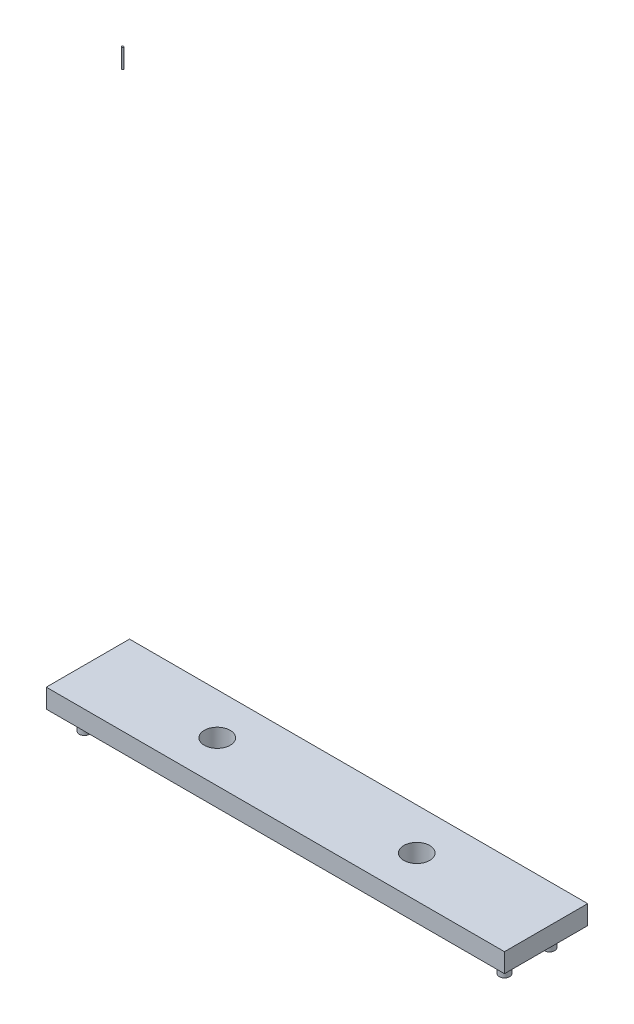
ISO-10303-21;
HEADER;
FILE_DESCRIPTION(('STEP AP214'),'2;1');
FILE_NAME('part.step','',(''),(''),'','','');
FILE_SCHEMA(('AUTOMOTIVE_DESIGN { 1 0 10303 214 1 1 1 1 }'));
ENDSEC;
DATA;
#1=APPLICATION_CONTEXT('core data for automotive mechanical design processes');
#2=APPLICATION_PROTOCOL_DEFINITION('international standard','automotive_design',2000,#1);
#3=PRODUCT_CONTEXT('',#1,'mechanical');
#4=PRODUCT('Part','Part','',(#3));
#5=PRODUCT_RELATED_PRODUCT_CATEGORY('part','',(#4));
#6=PRODUCT_DEFINITION_FORMATION('','',#4);
#7=PRODUCT_DEFINITION_CONTEXT('part definition',#1,'design');
#8=PRODUCT_DEFINITION('design','',#6,#7);
#9=PRODUCT_DEFINITION_SHAPE('','',#8);
#10=(LENGTH_UNIT() NAMED_UNIT(*) SI_UNIT(.MILLI.,.METRE.));
#11=(NAMED_UNIT(*) PLANE_ANGLE_UNIT() SI_UNIT($,.RADIAN.));
#12=(NAMED_UNIT(*) SI_UNIT($,.STERADIAN.) SOLID_ANGLE_UNIT());
#13=UNCERTAINTY_MEASURE_WITH_UNIT(LENGTH_MEASURE(1.E-05),#10,'distance_accuracy_value','');
#14=(GEOMETRIC_REPRESENTATION_CONTEXT(3) GLOBAL_UNCERTAINTY_ASSIGNED_CONTEXT((#13)) GLOBAL_UNIT_ASSIGNED_CONTEXT((#10,
#11,#12)) REPRESENTATION_CONTEXT('',''));
#15=CARTESIAN_POINT('',(0.,0.,0.));
#16=DIRECTION('',(0.,0.,1.));
#17=DIRECTION('',(1.,0.,0.));
#18=AXIS2_PLACEMENT_3D('',#15,#16,#17);
#19=CARTESIAN_POINT('',(-83.2665914148075,9.84022151221347,-77.1960620514841));
#20=DIRECTION('',(0.,1.,0.));
#21=DIRECTION('',(0.,0.,1.));
#22=AXIS2_PLACEMENT_3D('',#19,#20,#21);
#23=CYLINDRICAL_SURFACE('',#22,0.127);
#24=CARTESIAN_POINT('',(-83.2665914148075,9.84022151221347,-77.1960620514841));
#25=DIRECTION('',(0.,-1.,0.));
#26=DIRECTION('',(0.,0.,-1.));
#27=AXIS2_PLACEMENT_3D('',#24,#25,#26);
#28=CIRCLE('',#27,0.127);
#29=CARTESIAN_POINT('',(-83.2665914148075,9.84022151221347,-77.3230620514841));
#30=VERTEX_POINT('',#29);
#31=EDGE_CURVE('E11',#30,#30,#28,.T.);
#32=ORIENTED_EDGE('',*,*,#31,.F.);
#33=EDGE_LOOP('',(#32));
#34=FACE_BOUND('',#33,.T.);
#35=CARTESIAN_POINT('',(-83.2665914148075,12.3802215122135,-77.1960620514841));
#36=DIRECTION('',(0.,-1.,0.));
#37=DIRECTION('',(0.,0.,-1.));
#38=AXIS2_PLACEMENT_3D('',#35,#36,#37);
#39=CIRCLE('',#38,0.127);
#40=CARTESIAN_POINT('',(-83.2665914148075,12.3802215122135,-77.3230620514841));
#41=VERTEX_POINT('',#40);
#42=EDGE_CURVE('E51',#41,#41,#39,.T.);
#43=ORIENTED_EDGE('',*,*,#42,.T.);
#44=EDGE_LOOP('',(#43));
#45=FACE_BOUND('',#44,.T.);
#46=ADVANCED_FACE('F48',(#34,#45),#23,.T.);
#47=CARTESIAN_POINT('',(-83.2665914148075,9.84022151221347,-77.1960620514841));
#48=DIRECTION('',(0.,-1.,0.));
#49=DIRECTION('',(0.,0.,-1.));
#50=AXIS2_PLACEMENT_3D('',#47,#48,#49);
#51=PLANE('',#50);
#52=ORIENTED_EDGE('',*,*,#31,.T.);
#53=EDGE_LOOP('',(#52));
#54=FACE_BOUND('',#53,.T.);
#55=ADVANCED_FACE('F63',(#54),#51,.T.);
#56=CARTESIAN_POINT('',(-83.2665914148075,12.3802215122135,-77.1960620514841));
#57=DIRECTION('',(0.,-1.,0.));
#58=DIRECTION('',(0.,0.,-1.));
#59=AXIS2_PLACEMENT_3D('',#56,#57,#58);
#60=PLANE('',#59);
#61=ORIENTED_EDGE('',*,*,#42,.F.);
#62=EDGE_LOOP('',(#61));
#63=FACE_BOUND('',#62,.T.);
#64=ADVANCED_FACE('F61',(#63),#60,.F.);
#65=CLOSED_SHELL('',(#46,#55,#64));
#66=MANIFOLD_SOLID_BREP('B2',#65);
#67=CARTESIAN_POINT('',(18.3334085851925,12.3802215122135,-89.4915212328259));
#68=DIRECTION('',(0.,-1.,0.));
#69=DIRECTION('',(0.,0.,-1.));
#70=AXIS2_PLACEMENT_3D('',#67,#68,#69);
#71=PLANE('',#70);
#72=CARTESIAN_POINT('',(31.7260683833685,12.3802215122135,-1.3262620514841));
#73=DIRECTION('',(0.,-1.,0.));
#74=DIRECTION('',(0.,0.,-1.));
#75=AXIS2_PLACEMENT_3D('',#72,#73,#74);
#76=CIRCLE('',#75,1.7272);
#77=CARTESIAN_POINT('',(31.7260683833685,12.3802215122135,-3.0534620514841));
#78=VERTEX_POINT('',#77);
#79=EDGE_CURVE('E220',#78,#78,#76,.T.);
#80=ORIENTED_EDGE('',*,*,#79,.F.);
#81=EDGE_LOOP('',(#80));
#82=FACE_BOUND('',#81,.T.);
#83=CARTESIAN_POINT('',(40.0445683833685,12.3802215122135,-1.3262620514841));
#84=DIRECTION('',(0.,-1.,0.));
#85=DIRECTION('',(0.,0.,-1.));
#86=AXIS2_PLACEMENT_3D('',#83,#84,#85);
#87=CIRCLE('',#86,0.698499999999996);
#88=CARTESIAN_POINT('',(40.0445683833685,12.3802215122135,-2.02476205148409));
#89=VERTEX_POINT('',#88);
#90=EDGE_CURVE('E161',#89,#89,#87,.T.);
#91=ORIENTED_EDGE('',*,*,#90,.F.);
#92=EDGE_LOOP('',(#91));
#93=FACE_BOUND('',#92,.T.);
#94=CARTESIAN_POINT('',(46.3945683833685,12.3802215122135,1.67093794851591));
#95=DIRECTION('',(0.,-1.,0.));
#96=DIRECTION('',(0.,0.,-1.));
#97=AXIS2_PLACEMENT_3D('',#94,#95,#96);
#98=CIRCLE('',#97,0.698499999999996);
#99=CARTESIAN_POINT('',(46.3945683833685,12.3802215122135,0.972437948515911));
#100=VERTEX_POINT('',#99);
#101=EDGE_CURVE('E173',#100,#100,#98,.T.);
#102=ORIENTED_EDGE('',*,*,#101,.F.);
#103=EDGE_LOOP('',(#102));
#104=FACE_BOUND('',#103,.T.);
#105=CARTESIAN_POINT('',(-9.48543161663158,12.3802215122135,1.6709379485159));
#106=DIRECTION('',(0.,-1.,0.));
#107=DIRECTION('',(0.,0.,-1.));
#108=AXIS2_PLACEMENT_3D('',#105,#106,#107);
#109=CIRCLE('',#108,0.698499999999999);
#110=CARTESIAN_POINT('',(-9.48543161663158,12.3802215122135,0.9724379485159));
#111=VERTEX_POINT('',#110);
#112=EDGE_CURVE('E185',#111,#111,#109,.T.);
#113=ORIENTED_EDGE('',*,*,#112,.F.);
#114=EDGE_LOOP('',(#113));
#115=FACE_BOUND('',#114,.T.);
#116=CARTESIAN_POINT('',(-3.13543161663158,12.3802215122135,-1.3262620514841));
#117=DIRECTION('',(0.,-1.,0.));
#118=DIRECTION('',(0.,0.,-1.));
#119=AXIS2_PLACEMENT_3D('',#116,#117,#118);
#120=CIRCLE('',#119,0.6985);
#121=CARTESIAN_POINT('',(-3.13543161663158,12.3802215122135,-2.0247620514841));
#122=VERTEX_POINT('',#121);
#123=EDGE_CURVE('E92',#122,#122,#120,.T.);
#124=ORIENTED_EDGE('',*,*,#123,.F.);
#125=EDGE_LOOP('',(#124));
#126=FACE_BOUND('',#125,.T.);
#127=CARTESIAN_POINT('',(-9.48543161663158,12.3802215122135,-4.3234620514841));
#128=DIRECTION('',(0.,-1.,0.));
#129=DIRECTION('',(0.,0.,-1.));
#130=AXIS2_PLACEMENT_3D('',#127,#128,#129);
#131=CIRCLE('',#130,0.698499999999999);
#132=CARTESIAN_POINT('',(-9.48543161663158,12.3802215122135,-5.0219620514841));
#133=VERTEX_POINT('',#132);
#134=EDGE_CURVE('E179',#133,#133,#131,.T.);
#135=ORIENTED_EDGE('',*,*,#134,.F.);
#136=EDGE_LOOP('',(#135));
#137=FACE_BOUND('',#136,.T.);
#138=CARTESIAN_POINT('',(46.3945683833685,12.3802215122135,-4.3234620514841));
#139=DIRECTION('',(0.,-1.,0.));
#140=DIRECTION('',(0.,0.,-1.));
#141=AXIS2_PLACEMENT_3D('',#138,#139,#140);
#142=CIRCLE('',#141,0.698499999999996);
#143=CARTESIAN_POINT('',(46.3945683833685,12.3802215122135,-5.0219620514841));
#144=VERTEX_POINT('',#143);
#145=EDGE_CURVE('E167',#144,#144,#142,.T.);
#146=ORIENTED_EDGE('',*,*,#145,.F.);
#147=EDGE_LOOP('',(#146));
#148=FACE_BOUND('',#147,.T.);
#149=CARTESIAN_POINT('',(5.18306838336842,12.3802215122135,-1.3262620514841));
#150=DIRECTION('',(0.,-1.,0.));
#151=DIRECTION('',(0.,0.,-1.));
#152=AXIS2_PLACEMENT_3D('',#149,#150,#151);
#153=CIRCLE('',#152,1.7272);
#154=CARTESIAN_POINT('',(5.18306838336842,12.3802215122135,-3.0534620514841));
#155=VERTEX_POINT('',#154);
#156=EDGE_CURVE('E156',#155,#155,#153,.T.);
#157=ORIENTED_EDGE('',*,*,#156,.F.);
#158=EDGE_LOOP('',(#157));
#159=FACE_BOUND('',#158,.T.);
#160=DIRECTION('',(0.,0.,-1.));
#161=VECTOR('',#160,1.);
#162=CARTESIAN_POINT('',(-12.0254316166316,12.3802215122135,4.2109379485159));
#163=LINE('',#162,#161);
#164=CARTESIAN_POINT('',(-12.0254316166316,12.3802215122135,4.2109379485159));
#165=VERTEX_POINT('',#164);
#166=CARTESIAN_POINT('',(-12.0254316166316,12.3802215122135,-6.8634620514841));
#167=VERTEX_POINT('',#166);
#168=EDGE_CURVE('E135',#165,#167,#163,.T.);
#169=ORIENTED_EDGE('',*,*,#168,.T.);
#170=DIRECTION('',(1.,0.,0.));
#171=VECTOR('',#170,1.);
#172=CARTESIAN_POINT('',(-12.0254316166316,12.3802215122135,-6.8634620514841));
#173=LINE('',#172,#171);
#174=CARTESIAN_POINT('',(48.9345683833685,12.3802215122135,-6.8634620514841));
#175=VERTEX_POINT('',#174);
#176=EDGE_CURVE('E152',#167,#175,#173,.T.);
#177=ORIENTED_EDGE('',*,*,#176,.T.);
#178=DIRECTION('',(0.,0.,1.));
#179=VECTOR('',#178,1.);
#180=CARTESIAN_POINT('',(48.9345683833685,12.3802215122135,4.2109379485159));
#181=LINE('',#180,#179);
#182=CARTESIAN_POINT('',(48.9345683833685,12.3802215122135,4.2109379485159));
#183=VERTEX_POINT('',#182);
#184=EDGE_CURVE('E155',#175,#183,#181,.T.);
#185=ORIENTED_EDGE('',*,*,#184,.T.);
#186=DIRECTION('',(-1.,0.,0.));
#187=VECTOR('',#186,1.);
#188=CARTESIAN_POINT('',(-12.0254316166316,12.3802215122135,4.2109379485159));
#189=LINE('',#188,#187);
#190=EDGE_CURVE('E103',#183,#165,#189,.T.);
#191=ORIENTED_EDGE('',*,*,#190,.T.);
#192=EDGE_LOOP('',(#169,#177,#185,#191));
#193=FACE_BOUND('',#192,.T.);
#194=ADVANCED_FACE('F88',(#82,#93,#104,#115,#126,#137,#148,#159,#193),#71,.T.);
#195=CARTESIAN_POINT('',(-3.13543161663158,9.84022151221347,-1.3262620514841));
#196=DIRECTION('',(0.,1.,0.));
#197=DIRECTION('',(0.,0.,1.));
#198=AXIS2_PLACEMENT_3D('',#195,#196,#197);
#199=CYLINDRICAL_SURFACE('',#198,0.6985);
#200=CARTESIAN_POINT('',(-3.13543161663158,9.84022151221347,-1.3262620514841));
#201=DIRECTION('',(0.,-1.,0.));
#202=DIRECTION('',(0.,0.,-1.));
#203=AXIS2_PLACEMENT_3D('',#200,#201,#202);
#204=CIRCLE('',#203,0.6985);
#205=CARTESIAN_POINT('',(-3.13543161663158,9.84022151221347,-2.0247620514841));
#206=VERTEX_POINT('',#205);
#207=EDGE_CURVE('E46',#206,#206,#204,.T.);
#208=ORIENTED_EDGE('',*,*,#207,.F.);
#209=EDGE_LOOP('',(#208));
#210=FACE_BOUND('',#209,.T.);
#211=ORIENTED_EDGE('',*,*,#123,.T.);
#212=EDGE_LOOP('',(#211));
#213=FACE_BOUND('',#212,.T.);
#214=ADVANCED_FACE('F198',(#210,#213),#199,.T.);
#215=CARTESIAN_POINT('',(-3.13543161663158,9.84022151221347,-1.3262620514841));
#216=DIRECTION('',(0.,-1.,0.));
#217=DIRECTION('',(0.,0.,-1.));
#218=AXIS2_PLACEMENT_3D('',#215,#216,#217);
#219=PLANE('',#218);
#220=ORIENTED_EDGE('',*,*,#207,.T.);
#221=EDGE_LOOP('',(#220));
#222=FACE_BOUND('',#221,.T.);
#223=ADVANCED_FACE('F287',(#222),#219,.T.);
#224=CARTESIAN_POINT('',(-9.48543161663158,9.84022151221347,1.6709379485159));
#225=DIRECTION('',(0.,1.,0.));
#226=DIRECTION('',(0.,0.,1.));
#227=AXIS2_PLACEMENT_3D('',#224,#225,#226);
#228=CYLINDRICAL_SURFACE('',#227,0.698499999999999);
#229=CARTESIAN_POINT('',(-9.48543161663158,9.84022151221347,1.6709379485159));
#230=DIRECTION('',(0.,-1.,0.));
#231=DIRECTION('',(0.,0.,-1.));
#232=AXIS2_PLACEMENT_3D('',#229,#230,#231);
#233=CIRCLE('',#232,0.698499999999999);
#234=CARTESIAN_POINT('',(-9.48543161663158,9.84022151221347,0.9724379485159));
#235=VERTEX_POINT('',#234);
#236=EDGE_CURVE('E188',#235,#235,#233,.T.);
#237=ORIENTED_EDGE('',*,*,#236,.F.);
#238=EDGE_LOOP('',(#237));
#239=FACE_BOUND('',#238,.T.);
#240=ORIENTED_EDGE('',*,*,#112,.T.);
#241=EDGE_LOOP('',(#240));
#242=FACE_BOUND('',#241,.T.);
#243=ADVANCED_FACE('F194',(#239,#242),#228,.T.);
#244=CARTESIAN_POINT('',(-9.48543161663158,9.84022151221347,1.6709379485159));
#245=DIRECTION('',(0.,-1.,0.));
#246=DIRECTION('',(0.,0.,-1.));
#247=AXIS2_PLACEMENT_3D('',#244,#245,#246);
#248=PLANE('',#247);
#249=ORIENTED_EDGE('',*,*,#236,.T.);
#250=EDGE_LOOP('',(#249));
#251=FACE_BOUND('',#250,.T.);
#252=ADVANCED_FACE('F280',(#251),#248,.T.);
#253=CARTESIAN_POINT('',(-9.48543161663158,9.84022151221347,-4.3234620514841));
#254=DIRECTION('',(0.,1.,0.));
#255=DIRECTION('',(0.,0.,1.));
#256=AXIS2_PLACEMENT_3D('',#253,#254,#255);
#257=CYLINDRICAL_SURFACE('',#256,0.698499999999999);
#258=CARTESIAN_POINT('',(-9.48543161663158,9.84022151221347,-4.3234620514841));
#259=DIRECTION('',(0.,-1.,0.));
#260=DIRECTION('',(0.,0.,-1.));
#261=AXIS2_PLACEMENT_3D('',#258,#259,#260);
#262=CIRCLE('',#261,0.698499999999999);
#263=CARTESIAN_POINT('',(-9.48543161663158,9.84022151221347,-5.0219620514841));
#264=VERTEX_POINT('',#263);
#265=EDGE_CURVE('E182',#264,#264,#262,.T.);
#266=ORIENTED_EDGE('',*,*,#265,.F.);
#267=EDGE_LOOP('',(#266));
#268=FACE_BOUND('',#267,.T.);
#269=ORIENTED_EDGE('',*,*,#134,.T.);
#270=EDGE_LOOP('',(#269));
#271=FACE_BOUND('',#270,.T.);
#272=ADVANCED_FACE('F276',(#268,#271),#257,.T.);
#273=CARTESIAN_POINT('',(-9.48543161663158,9.84022151221347,-4.3234620514841));
#274=DIRECTION('',(0.,-1.,0.));
#275=DIRECTION('',(0.,0.,-1.));
#276=AXIS2_PLACEMENT_3D('',#273,#274,#275);
#277=PLANE('',#276);
#278=ORIENTED_EDGE('',*,*,#265,.T.);
#279=EDGE_LOOP('',(#278));
#280=FACE_BOUND('',#279,.T.);
#281=ADVANCED_FACE('F272',(#280),#277,.T.);
#282=CARTESIAN_POINT('',(46.3945683833685,9.84022151221347,1.67093794851591));
#283=DIRECTION('',(0.,1.,0.));
#284=DIRECTION('',(0.,0.,1.));
#285=AXIS2_PLACEMENT_3D('',#282,#283,#284);
#286=CYLINDRICAL_SURFACE('',#285,0.698499999999996);
#287=CARTESIAN_POINT('',(46.3945683833685,9.84022151221347,1.67093794851591));
#288=DIRECTION('',(0.,-1.,0.));
#289=DIRECTION('',(0.,0.,-1.));
#290=AXIS2_PLACEMENT_3D('',#287,#288,#289);
#291=CIRCLE('',#290,0.698499999999996);
#292=CARTESIAN_POINT('',(46.3945683833685,9.84022151221347,0.972437948515911));
#293=VERTEX_POINT('',#292);
#294=EDGE_CURVE('E176',#293,#293,#291,.T.);
#295=ORIENTED_EDGE('',*,*,#294,.F.);
#296=EDGE_LOOP('',(#295));
#297=FACE_BOUND('',#296,.T.);
#298=ORIENTED_EDGE('',*,*,#101,.T.);
#299=EDGE_LOOP('',(#298));
#300=FACE_BOUND('',#299,.T.);
#301=ADVANCED_FACE('F268',(#297,#300),#286,.T.);
#302=CARTESIAN_POINT('',(46.3945683833685,9.84022151221347,1.67093794851591));
#303=DIRECTION('',(0.,-1.,0.));
#304=DIRECTION('',(0.,0.,-1.));
#305=AXIS2_PLACEMENT_3D('',#302,#303,#304);
#306=PLANE('',#305);
#307=ORIENTED_EDGE('',*,*,#294,.T.);
#308=EDGE_LOOP('',(#307));
#309=FACE_BOUND('',#308,.T.);
#310=ADVANCED_FACE('F264',(#309),#306,.T.);
#311=CARTESIAN_POINT('',(46.3945683833685,9.84022151221347,-4.3234620514841));
#312=DIRECTION('',(0.,1.,0.));
#313=DIRECTION('',(0.,0.,1.));
#314=AXIS2_PLACEMENT_3D('',#311,#312,#313);
#315=CYLINDRICAL_SURFACE('',#314,0.698499999999996);
#316=CARTESIAN_POINT('',(46.3945683833685,9.84022151221347,-4.3234620514841));
#317=DIRECTION('',(0.,-1.,0.));
#318=DIRECTION('',(0.,0.,-1.));
#319=AXIS2_PLACEMENT_3D('',#316,#317,#318);
#320=CIRCLE('',#319,0.698499999999996);
#321=CARTESIAN_POINT('',(46.3945683833685,9.84022151221347,-5.0219620514841));
#322=VERTEX_POINT('',#321);
#323=EDGE_CURVE('E170',#322,#322,#320,.T.);
#324=ORIENTED_EDGE('',*,*,#323,.F.);
#325=EDGE_LOOP('',(#324));
#326=FACE_BOUND('',#325,.T.);
#327=ORIENTED_EDGE('',*,*,#145,.T.);
#328=EDGE_LOOP('',(#327));
#329=FACE_BOUND('',#328,.T.);
#330=ADVANCED_FACE('F260',(#326,#329),#315,.T.);
#331=CARTESIAN_POINT('',(46.3945683833685,9.84022151221347,-4.3234620514841));
#332=DIRECTION('',(0.,-1.,0.));
#333=DIRECTION('',(0.,0.,-1.));
#334=AXIS2_PLACEMENT_3D('',#331,#332,#333);
#335=PLANE('',#334);
#336=ORIENTED_EDGE('',*,*,#323,.T.);
#337=EDGE_LOOP('',(#336));
#338=FACE_BOUND('',#337,.T.);
#339=ADVANCED_FACE('F256',(#338),#335,.T.);
#340=CARTESIAN_POINT('',(40.0445683833685,9.84022151221347,-1.3262620514841));
#341=DIRECTION('',(0.,1.,0.));
#342=DIRECTION('',(0.,0.,1.));
#343=AXIS2_PLACEMENT_3D('',#340,#341,#342);
#344=CYLINDRICAL_SURFACE('',#343,0.698499999999996);
#345=CARTESIAN_POINT('',(40.0445683833685,9.84022151221347,-1.3262620514841));
#346=DIRECTION('',(0.,-1.,0.));
#347=DIRECTION('',(0.,0.,-1.));
#348=AXIS2_PLACEMENT_3D('',#345,#346,#347);
#349=CIRCLE('',#348,0.698499999999996);
#350=CARTESIAN_POINT('',(40.0445683833685,9.84022151221347,-2.02476205148409));
#351=VERTEX_POINT('',#350);
#352=EDGE_CURVE('E164',#351,#351,#349,.T.);
#353=ORIENTED_EDGE('',*,*,#352,.F.);
#354=EDGE_LOOP('',(#353));
#355=FACE_BOUND('',#354,.T.);
#356=ORIENTED_EDGE('',*,*,#90,.T.);
#357=EDGE_LOOP('',(#356));
#358=FACE_BOUND('',#357,.T.);
#359=ADVANCED_FACE('F252',(#355,#358),#344,.T.);
#360=CARTESIAN_POINT('',(40.0445683833685,9.84022151221347,-1.3262620514841));
#361=DIRECTION('',(0.,-1.,0.));
#362=DIRECTION('',(0.,0.,-1.));
#363=AXIS2_PLACEMENT_3D('',#360,#361,#362);
#364=PLANE('',#363);
#365=ORIENTED_EDGE('',*,*,#352,.T.);
#366=EDGE_LOOP('',(#365));
#367=FACE_BOUND('',#366,.T.);
#368=ADVANCED_FACE('F249',(#367),#364,.T.);
#369=CARTESIAN_POINT('',(-12.0254316166316,14.9202215122135,-6.8634620514841));
#370=DIRECTION('',(0.,0.,-1.));
#371=DIRECTION('',(-1.,0.,0.));
#372=AXIS2_PLACEMENT_3D('',#369,#370,#371);
#373=PLANE('',#372);
#374=ORIENTED_EDGE('',*,*,#176,.F.);
#375=DIRECTION('',(0.,-1.,0.));
#376=VECTOR('',#375,1.);
#377=CARTESIAN_POINT('',(-12.0254316166316,14.9202215122135,-6.8634620514841));
#378=LINE('',#377,#376);
#379=CARTESIAN_POINT('',(-12.0254316166316,14.9202215122135,-6.8634620514841));
#380=VERTEX_POINT('',#379);
#381=EDGE_CURVE('E136',#380,#167,#378,.T.);
#382=ORIENTED_EDGE('',*,*,#381,.F.);
#383=DIRECTION('',(1.,0.,0.));
#384=VECTOR('',#383,1.);
#385=CARTESIAN_POINT('',(-12.0254316166316,14.9202215122135,-6.8634620514841));
#386=LINE('',#385,#384);
#387=CARTESIAN_POINT('',(48.9345683833685,14.9202215122135,-6.8634620514841));
#388=VERTEX_POINT('',#387);
#389=EDGE_CURVE('E111',#380,#388,#386,.T.);
#390=ORIENTED_EDGE('',*,*,#389,.T.);
#391=DIRECTION('',(0.,-1.,0.));
#392=VECTOR('',#391,1.);
#393=CARTESIAN_POINT('',(48.9345683833685,14.9202215122135,-6.8634620514841));
#394=LINE('',#393,#392);
#395=EDGE_CURVE('E147',#388,#175,#394,.T.);
#396=ORIENTED_EDGE('',*,*,#395,.T.);
#397=EDGE_LOOP('',(#374,#382,#390,#396));
#398=FACE_BOUND('',#397,.T.);
#399=ADVANCED_FACE('F242',(#398),#373,.T.);
#400=CARTESIAN_POINT('',(-12.0254316166316,14.9202215122135,4.2109379485159));
#401=DIRECTION('',(-1.,0.,0.));
#402=DIRECTION('',(0.,0.,1.));
#403=AXIS2_PLACEMENT_3D('',#400,#401,#402);
#404=PLANE('',#403);
#405=ORIENTED_EDGE('',*,*,#168,.F.);
#406=DIRECTION('',(0.,-1.,0.));
#407=VECTOR('',#406,1.);
#408=CARTESIAN_POINT('',(-12.0254316166316,14.9202215122135,4.2109379485159));
#409=LINE('',#408,#407);
#410=CARTESIAN_POINT('',(-12.0254316166316,14.9202215122135,4.2109379485159));
#411=VERTEX_POINT('',#410);
#412=EDGE_CURVE('E129',#411,#165,#409,.T.);
#413=ORIENTED_EDGE('',*,*,#412,.F.);
#414=DIRECTION('',(0.,0.,-1.));
#415=VECTOR('',#414,1.);
#416=CARTESIAN_POINT('',(-12.0254316166316,14.9202215122135,4.2109379485159));
#417=LINE('',#416,#415);
#418=EDGE_CURVE('E133',#411,#380,#417,.T.);
#419=ORIENTED_EDGE('',*,*,#418,.T.);
#420=ORIENTED_EDGE('',*,*,#381,.T.);
#421=EDGE_LOOP('',(#405,#413,#419,#420));
#422=FACE_BOUND('',#421,.T.);
#423=ADVANCED_FACE('F131',(#422),#404,.T.);
#424=CARTESIAN_POINT('',(-12.0254316166316,14.9202215122135,4.2109379485159));
#425=DIRECTION('',(0.,0.,1.));
#426=DIRECTION('',(1.,0.,0.));
#427=AXIS2_PLACEMENT_3D('',#424,#425,#426);
#428=PLANE('',#427);
#429=ORIENTED_EDGE('',*,*,#190,.F.);
#430=DIRECTION('',(0.,-1.,0.));
#431=VECTOR('',#430,1.);
#432=CARTESIAN_POINT('',(48.9345683833685,14.9202215122135,4.2109379485159));
#433=LINE('',#432,#431);
#434=CARTESIAN_POINT('',(48.9345683833685,14.9202215122135,4.2109379485159));
#435=VERTEX_POINT('',#434);
#436=EDGE_CURVE('E137',#435,#183,#433,.T.);
#437=ORIENTED_EDGE('',*,*,#436,.F.);
#438=DIRECTION('',(-1.,0.,0.));
#439=VECTOR('',#438,1.);
#440=CARTESIAN_POINT('',(-12.0254316166316,14.9202215122135,4.2109379485159));
#441=LINE('',#440,#439);
#442=EDGE_CURVE('E140',#435,#411,#441,.T.);
#443=ORIENTED_EDGE('',*,*,#442,.T.);
#444=ORIENTED_EDGE('',*,*,#412,.T.);
#445=EDGE_LOOP('',(#429,#437,#443,#444));
#446=FACE_BOUND('',#445,.T.);
#447=ADVANCED_FACE('F141',(#446),#428,.T.);
#448=CARTESIAN_POINT('',(48.9345683833685,14.9202215122135,4.2109379485159));
#449=DIRECTION('',(1.,0.,0.));
#450=DIRECTION('',(0.,0.,-1.));
#451=AXIS2_PLACEMENT_3D('',#448,#449,#450);
#452=PLANE('',#451);
#453=ORIENTED_EDGE('',*,*,#184,.F.);
#454=ORIENTED_EDGE('',*,*,#395,.F.);
#455=DIRECTION('',(0.,0.,1.));
#456=VECTOR('',#455,1.);
#457=CARTESIAN_POINT('',(48.9345683833685,14.9202215122135,4.2109379485159));
#458=LINE('',#457,#456);
#459=EDGE_CURVE('E145',#388,#435,#458,.T.);
#460=ORIENTED_EDGE('',*,*,#459,.T.);
#461=ORIENTED_EDGE('',*,*,#436,.T.);
#462=EDGE_LOOP('',(#453,#454,#460,#461));
#463=FACE_BOUND('',#462,.T.);
#464=ADVANCED_FACE('F213',(#463),#452,.T.);
#465=CARTESIAN_POINT('',(18.3334085851925,14.9202215122135,-89.4915212328259));
#466=DIRECTION('',(0.,-1.,0.));
#467=DIRECTION('',(0.,0.,-1.));
#468=AXIS2_PLACEMENT_3D('',#465,#466,#467);
#469=PLANE('',#468);
#470=CARTESIAN_POINT('',(31.7260683833685,14.9202215122135,-1.3262620514841));
#471=DIRECTION('',(0.,-1.,0.));
#472=DIRECTION('',(0.,0.,-1.));
#473=AXIS2_PLACEMENT_3D('',#470,#471,#472);
#474=CIRCLE('',#473,1.7272);
#475=CARTESIAN_POINT('',(31.7260683833685,14.9202215122135,-3.0534620514841));
#476=VERTEX_POINT('',#475);
#477=EDGE_CURVE('E223',#476,#476,#474,.T.);
#478=ORIENTED_EDGE('',*,*,#477,.T.);
#479=EDGE_LOOP('',(#478));
#480=FACE_BOUND('',#479,.T.);
#481=CARTESIAN_POINT('',(5.18306838336842,14.9202215122135,-1.3262620514841));
#482=DIRECTION('',(0.,-1.,0.));
#483=DIRECTION('',(0.,0.,-1.));
#484=AXIS2_PLACEMENT_3D('',#481,#482,#483);
#485=CIRCLE('',#484,1.7272);
#486=CARTESIAN_POINT('',(5.18306838336842,14.9202215122135,-3.0534620514841));
#487=VERTEX_POINT('',#486);
#488=EDGE_CURVE('E217',#487,#487,#485,.T.);
#489=ORIENTED_EDGE('',*,*,#488,.T.);
#490=EDGE_LOOP('',(#489));
#491=FACE_BOUND('',#490,.T.);
#492=ORIENTED_EDGE('',*,*,#389,.F.);
#493=ORIENTED_EDGE('',*,*,#418,.F.);
#494=ORIENTED_EDGE('',*,*,#442,.F.);
#495=ORIENTED_EDGE('',*,*,#459,.F.);
#496=EDGE_LOOP('',(#492,#493,#494,#495));
#497=FACE_BOUND('',#496,.T.);
#498=ADVANCED_FACE('F90',(#480,#491,#497),#469,.F.);
#499=CARTESIAN_POINT('',(5.18306838336842,14.9202215122135,-1.3262620514841));
#500=DIRECTION('',(0.,-1.,0.));
#501=DIRECTION('',(0.,0.,-1.));
#502=AXIS2_PLACEMENT_3D('',#499,#500,#501);
#503=CYLINDRICAL_SURFACE('',#502,1.7272);
#504=ORIENTED_EDGE('',*,*,#156,.T.);
#505=EDGE_LOOP('',(#504));
#506=FACE_BOUND('',#505,.T.);
#507=ORIENTED_EDGE('',*,*,#488,.F.);
#508=EDGE_LOOP('',(#507));
#509=FACE_BOUND('',#508,.T.);
#510=ADVANCED_FACE('F231',(#506,#509),#503,.F.);
#511=CARTESIAN_POINT('',(31.7260683833685,14.9202215122135,-1.3262620514841));
#512=DIRECTION('',(0.,-1.,0.));
#513=DIRECTION('',(0.,0.,-1.));
#514=AXIS2_PLACEMENT_3D('',#511,#512,#513);
#515=CYLINDRICAL_SURFACE('',#514,1.7272);
#516=ORIENTED_EDGE('',*,*,#79,.T.);
#517=EDGE_LOOP('',(#516));
#518=FACE_BOUND('',#517,.T.);
#519=ORIENTED_EDGE('',*,*,#477,.F.);
#520=EDGE_LOOP('',(#519));
#521=FACE_BOUND('',#520,.T.);
#522=ADVANCED_FACE('F229',(#518,#521),#515,.F.);
#523=CLOSED_SHELL('',(#194,#214,#223,#243,#252,#272,#281,#301,#310,#330,#339,#359,#368,#399,
#423,#447,#464,#498,#510,#522));
#524=MANIFOLD_SOLID_BREP('B6',#523);
#525=ADVANCED_BREP_SHAPE_REPRESENTATION('',(#18,#66,#524),#14);
#526=SHAPE_DEFINITION_REPRESENTATION(#9,#525);
ENDSEC;
END-ISO-10303-21;
